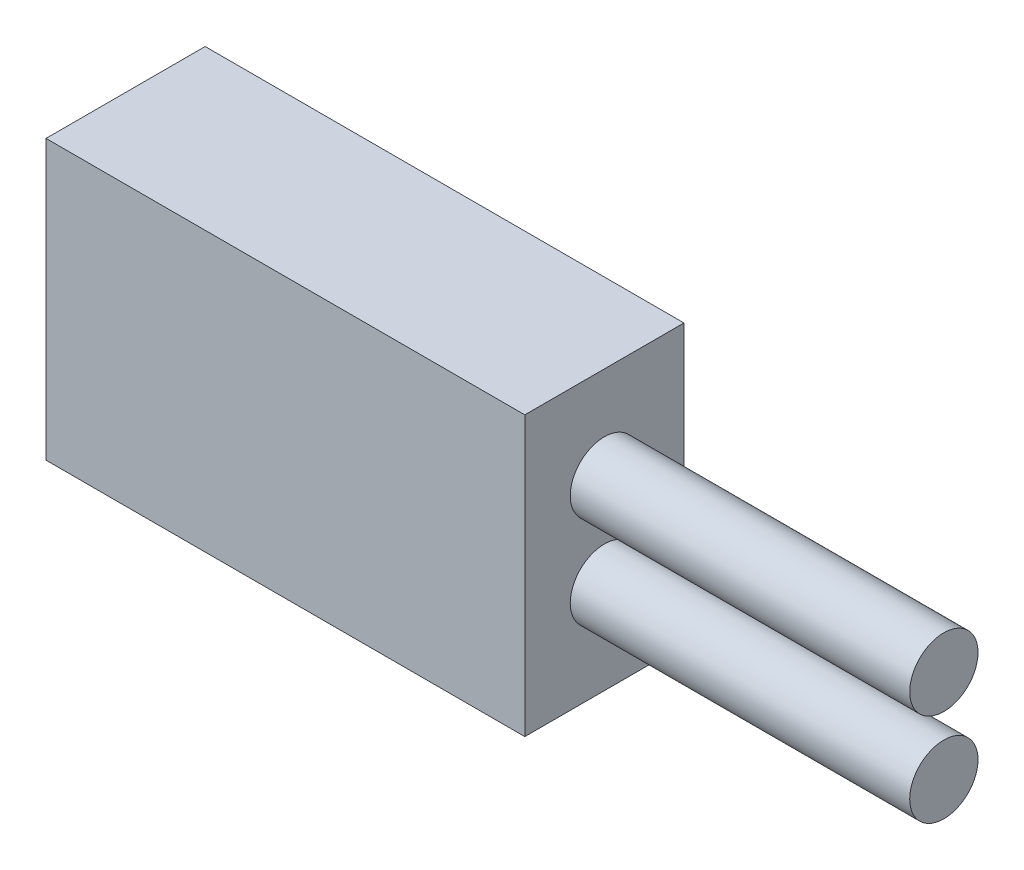
ISO-10303-21;
HEADER;
FILE_DESCRIPTION(('STEP AP214'),'2;1');
FILE_NAME('part.step','',(''),(''),'','','');
FILE_SCHEMA(('AUTOMOTIVE_DESIGN { 1 0 10303 214 1 1 1 1 }'));
ENDSEC;
DATA;
#1=APPLICATION_CONTEXT('core data for automotive mechanical design processes');
#2=APPLICATION_PROTOCOL_DEFINITION('international standard','automotive_design',2000,#1);
#3=PRODUCT_CONTEXT('',#1,'mechanical');
#4=PRODUCT('Part','Part','',(#3));
#5=PRODUCT_RELATED_PRODUCT_CATEGORY('part','',(#4));
#6=PRODUCT_DEFINITION_FORMATION('','',#4);
#7=PRODUCT_DEFINITION_CONTEXT('part definition',#1,'design');
#8=PRODUCT_DEFINITION('design','',#6,#7);
#9=PRODUCT_DEFINITION_SHAPE('','',#8);
#10=(LENGTH_UNIT() NAMED_UNIT(*) SI_UNIT(.MILLI.,.METRE.));
#11=(NAMED_UNIT(*) PLANE_ANGLE_UNIT() SI_UNIT($,.RADIAN.));
#12=(NAMED_UNIT(*) SI_UNIT($,.STERADIAN.) SOLID_ANGLE_UNIT());
#13=UNCERTAINTY_MEASURE_WITH_UNIT(LENGTH_MEASURE(1.E-05),#10,'distance_accuracy_value','');
#14=(GEOMETRIC_REPRESENTATION_CONTEXT(3) GLOBAL_UNCERTAINTY_ASSIGNED_CONTEXT((#13)) GLOBAL_UNIT_ASSIGNED_CONTEXT((#10,
#11,#12)) REPRESENTATION_CONTEXT('',''));
#15=CARTESIAN_POINT('',(0.,0.,0.));
#16=DIRECTION('',(0.,0.,1.));
#17=DIRECTION('',(1.,0.,0.));
#18=AXIS2_PLACEMENT_3D('',#15,#16,#17);
#19=CARTESIAN_POINT('',(0.,0.,23.3));
#20=DIRECTION('',(1.,0.,0.));
#21=DIRECTION('',(0.,0.,-1.));
#22=AXIS2_PLACEMENT_3D('',#19,#20,#21);
#23=PLANE('',#22);
#24=DIRECTION('',(0.,-1.,0.));
#25=VECTOR('',#24,1.);
#26=CARTESIAN_POINT('',(0.,0.,0.));
#27=LINE('',#26,#25);
#28=CARTESIAN_POINT('',(0.,40.8,0.));
#29=VERTEX_POINT('',#28);
#30=CARTESIAN_POINT('',(0.,0.,0.));
#31=VERTEX_POINT('',#30);
#32=EDGE_CURVE('E111',#29,#31,#27,.T.);
#33=ORIENTED_EDGE('',*,*,#32,.T.);
#34=DIRECTION('',(0.,0.,-1.));
#35=VECTOR('',#34,1.);
#36=CARTESIAN_POINT('',(0.,0.,23.3));
#37=LINE('',#36,#35);
#38=CARTESIAN_POINT('',(0.,0.,23.3));
#39=VERTEX_POINT('',#38);
#40=EDGE_CURVE('E100',#39,#31,#37,.T.);
#41=ORIENTED_EDGE('',*,*,#40,.F.);
#42=DIRECTION('',(0.,-1.,0.));
#43=VECTOR('',#42,1.);
#44=CARTESIAN_POINT('',(0.,0.,23.3));
#45=LINE('',#44,#43);
#46=CARTESIAN_POINT('',(0.,40.8,23.3));
#47=VERTEX_POINT('',#46);
#48=EDGE_CURVE('E92',#47,#39,#45,.T.);
#49=ORIENTED_EDGE('',*,*,#48,.F.);
#50=DIRECTION('',(0.,0.,-1.));
#51=VECTOR('',#50,1.);
#52=CARTESIAN_POINT('',(0.,40.8,23.3));
#53=LINE('',#52,#51);
#54=EDGE_CURVE('E107',#47,#29,#53,.T.);
#55=ORIENTED_EDGE('',*,*,#54,.T.);
#56=EDGE_LOOP('',(#33,#41,#49,#55));
#57=FACE_BOUND('',#56,.T.);
#58=ADVANCED_FACE('F39',(#57),#23,.F.);
#59=CARTESIAN_POINT('',(0.,0.,23.3));
#60=DIRECTION('',(0.,1.,0.));
#61=DIRECTION('',(0.,0.,1.));
#62=AXIS2_PLACEMENT_3D('',#59,#60,#61);
#63=PLANE('',#62);
#64=DIRECTION('',(1.,0.,0.));
#65=VECTOR('',#64,1.);
#66=CARTESIAN_POINT('',(0.,0.,0.));
#67=LINE('',#66,#65);
#68=CARTESIAN_POINT('',(70.1,0.,0.));
#69=VERTEX_POINT('',#68);
#70=EDGE_CURVE('E98',#31,#69,#67,.T.);
#71=ORIENTED_EDGE('',*,*,#70,.T.);
#72=DIRECTION('',(0.,0.,-1.));
#73=VECTOR('',#72,1.);
#74=CARTESIAN_POINT('',(70.1,0.,23.3));
#75=LINE('',#74,#73);
#76=CARTESIAN_POINT('',(70.1,0.,23.3));
#77=VERTEX_POINT('',#76);
#78=EDGE_CURVE('E96',#77,#69,#75,.T.);
#79=ORIENTED_EDGE('',*,*,#78,.F.);
#80=DIRECTION('',(1.,0.,0.));
#81=VECTOR('',#80,1.);
#82=CARTESIAN_POINT('',(0.,0.,23.3));
#83=LINE('',#82,#81);
#84=EDGE_CURVE('E87',#39,#77,#83,.T.);
#85=ORIENTED_EDGE('',*,*,#84,.F.);
#86=ORIENTED_EDGE('',*,*,#40,.T.);
#87=EDGE_LOOP('',(#71,#79,#85,#86));
#88=FACE_BOUND('',#87,.T.);
#89=ADVANCED_FACE('F97',(#88),#63,.F.);
#90=CARTESIAN_POINT('',(70.1,0.,23.3));
#91=DIRECTION('',(-1.,0.,0.));
#92=DIRECTION('',(0.,0.,1.));
#93=AXIS2_PLACEMENT_3D('',#90,#91,#92);
#94=PLANE('',#93);
#95=CARTESIAN_POINT('',(70.1,13.6,11.65));
#96=DIRECTION('',(-1.,0.,0.));
#97=DIRECTION('',(0.,0.,1.));
#98=AXIS2_PLACEMENT_3D('',#95,#96,#97);
#99=CIRCLE('',#98,5.);
#100=CARTESIAN_POINT('',(70.1,13.6,16.65));
#101=VERTEX_POINT('',#100);
#102=EDGE_CURVE('E11',#101,#101,#99,.F.);
#103=ORIENTED_EDGE('',*,*,#102,.F.);
#104=EDGE_LOOP('',(#103));
#105=FACE_BOUND('',#104,.T.);
#106=CARTESIAN_POINT('',(70.1,27.2,11.65));
#107=DIRECTION('',(1.,0.,0.));
#108=DIRECTION('',(0.,0.,-1.));
#109=AXIS2_PLACEMENT_3D('',#106,#107,#108);
#110=CIRCLE('',#109,5.);
#111=CARTESIAN_POINT('',(70.1,27.2,6.65));
#112=VERTEX_POINT('',#111);
#113=EDGE_CURVE('E48',#112,#112,#110,.T.);
#114=ORIENTED_EDGE('',*,*,#113,.F.);
#115=EDGE_LOOP('',(#114));
#116=FACE_BOUND('',#115,.T.);
#117=DIRECTION('',(0.,1.,0.));
#118=VECTOR('',#117,1.);
#119=CARTESIAN_POINT('',(70.1,0.,0.));
#120=LINE('',#119,#118);
#121=CARTESIAN_POINT('',(70.1,40.8,0.));
#122=VERTEX_POINT('',#121);
#123=EDGE_CURVE('E73',#69,#122,#120,.T.);
#124=ORIENTED_EDGE('',*,*,#123,.T.);
#125=DIRECTION('',(0.,0.,-1.));
#126=VECTOR('',#125,1.);
#127=CARTESIAN_POINT('',(70.1,40.8,23.3));
#128=LINE('',#127,#126);
#129=CARTESIAN_POINT('',(70.1,40.8,23.3));
#130=VERTEX_POINT('',#129);
#131=EDGE_CURVE('E101',#130,#122,#128,.T.);
#132=ORIENTED_EDGE('',*,*,#131,.F.);
#133=DIRECTION('',(0.,1.,0.));
#134=VECTOR('',#133,1.);
#135=CARTESIAN_POINT('',(70.1,0.,23.3));
#136=LINE('',#135,#134);
#137=EDGE_CURVE('E90',#77,#130,#136,.T.);
#138=ORIENTED_EDGE('',*,*,#137,.F.);
#139=ORIENTED_EDGE('',*,*,#78,.T.);
#140=EDGE_LOOP('',(#124,#132,#138,#139));
#141=FACE_BOUND('',#140,.T.);
#142=ADVANCED_FACE('F103',(#105,#116,#141),#94,.F.);
#143=CARTESIAN_POINT('',(0.,40.8,23.3));
#144=DIRECTION('',(0.,-1.,0.));
#145=DIRECTION('',(0.,0.,-1.));
#146=AXIS2_PLACEMENT_3D('',#143,#144,#145);
#147=PLANE('',#146);
#148=DIRECTION('',(-1.,0.,0.));
#149=VECTOR('',#148,1.);
#150=CARTESIAN_POINT('',(0.,40.8,0.));
#151=LINE('',#150,#149);
#152=EDGE_CURVE('E79',#122,#29,#151,.T.);
#153=ORIENTED_EDGE('',*,*,#152,.T.);
#154=ORIENTED_EDGE('',*,*,#54,.F.);
#155=DIRECTION('',(-1.,0.,0.));
#156=VECTOR('',#155,1.);
#157=CARTESIAN_POINT('',(0.,40.8,23.3));
#158=LINE('',#157,#156);
#159=EDGE_CURVE('E56',#130,#47,#158,.T.);
#160=ORIENTED_EDGE('',*,*,#159,.F.);
#161=ORIENTED_EDGE('',*,*,#131,.T.);
#162=EDGE_LOOP('',(#153,#154,#160,#161));
#163=FACE_BOUND('',#162,.T.);
#164=ADVANCED_FACE('F152',(#163),#147,.F.);
#165=CARTESIAN_POINT('',(0.,0.,23.3));
#166=DIRECTION('',(0.,0.,-1.));
#167=DIRECTION('',(-1.,0.,0.));
#168=AXIS2_PLACEMENT_3D('',#165,#166,#167);
#169=PLANE('',#168);
#170=ORIENTED_EDGE('',*,*,#48,.T.);
#171=ORIENTED_EDGE('',*,*,#84,.T.);
#172=ORIENTED_EDGE('',*,*,#137,.T.);
#173=ORIENTED_EDGE('',*,*,#159,.T.);
#174=EDGE_LOOP('',(#170,#171,#172,#173));
#175=FACE_BOUND('',#174,.T.);
#176=ADVANCED_FACE('F88',(#175),#169,.F.);
#177=CARTESIAN_POINT('',(0.,0.,0.));
#178=DIRECTION('',(0.,0.,-1.));
#179=DIRECTION('',(-1.,0.,0.));
#180=AXIS2_PLACEMENT_3D('',#177,#178,#179);
#181=PLANE('',#180);
#182=ORIENTED_EDGE('',*,*,#32,.F.);
#183=ORIENTED_EDGE('',*,*,#152,.F.);
#184=ORIENTED_EDGE('',*,*,#123,.F.);
#185=ORIENTED_EDGE('',*,*,#70,.F.);
#186=EDGE_LOOP('',(#182,#183,#184,#185));
#187=FACE_BOUND('',#186,.T.);
#188=ADVANCED_FACE('F165',(#187),#181,.T.);
#189=CARTESIAN_POINT('',(119.8,27.2,11.65));
#190=DIRECTION('',(-1.,0.,0.));
#191=DIRECTION('',(0.,0.,1.));
#192=AXIS2_PLACEMENT_3D('',#189,#190,#191);
#193=CYLINDRICAL_SURFACE('',#192,5.);
#194=CARTESIAN_POINT('',(119.8,27.2,11.65));
#195=DIRECTION('',(1.,0.,0.));
#196=DIRECTION('',(0.,0.,-1.));
#197=AXIS2_PLACEMENT_3D('',#194,#195,#196);
#198=CIRCLE('',#197,5.);
#199=CARTESIAN_POINT('',(119.8,27.2,6.65));
#200=VERTEX_POINT('',#199);
#201=EDGE_CURVE('E115',#200,#200,#198,.T.);
#202=ORIENTED_EDGE('',*,*,#201,.F.);
#203=EDGE_LOOP('',(#202));
#204=FACE_BOUND('',#203,.T.);
#205=ORIENTED_EDGE('',*,*,#113,.T.);
#206=EDGE_LOOP('',(#205));
#207=FACE_BOUND('',#206,.T.);
#208=ADVANCED_FACE('F167',(#204,#207),#193,.T.);
#209=CARTESIAN_POINT('',(119.8,27.2,11.65));
#210=DIRECTION('',(1.,0.,0.));
#211=DIRECTION('',(0.,0.,-1.));
#212=AXIS2_PLACEMENT_3D('',#209,#210,#211);
#213=PLANE('',#212);
#214=ORIENTED_EDGE('',*,*,#201,.T.);
#215=EDGE_LOOP('',(#214));
#216=FACE_BOUND('',#215,.T.);
#217=ADVANCED_FACE('F146',(#216),#213,.T.);
#218=CARTESIAN_POINT('',(119.8,13.6,11.65));
#219=DIRECTION('',(-1.,0.,0.));
#220=DIRECTION('',(0.,0.,1.));
#221=AXIS2_PLACEMENT_3D('',#218,#219,#220);
#222=CYLINDRICAL_SURFACE('',#221,5.);
#223=CARTESIAN_POINT('',(119.8,13.6,11.65));
#224=DIRECTION('',(1.,0.,0.));
#225=DIRECTION('',(0.,0.,-1.));
#226=AXIS2_PLACEMENT_3D('',#223,#224,#225);
#227=CIRCLE('',#226,5.);
#228=CARTESIAN_POINT('',(119.8,13.6,6.65));
#229=VERTEX_POINT('',#228);
#230=EDGE_CURVE('E137',#229,#229,#227,.T.);
#231=ORIENTED_EDGE('',*,*,#230,.F.);
#232=EDGE_LOOP('',(#231));
#233=FACE_BOUND('',#232,.T.);
#234=ORIENTED_EDGE('',*,*,#102,.T.);
#235=EDGE_LOOP('',(#234));
#236=FACE_BOUND('',#235,.T.);
#237=ADVANCED_FACE('F143',(#233,#236),#222,.T.);
#238=CARTESIAN_POINT('',(119.8,13.6,11.65));
#239=DIRECTION('',(1.,0.,0.));
#240=DIRECTION('',(0.,0.,-1.));
#241=AXIS2_PLACEMENT_3D('',#238,#239,#240);
#242=PLANE('',#241);
#243=ORIENTED_EDGE('',*,*,#230,.T.);
#244=EDGE_LOOP('',(#243));
#245=FACE_BOUND('',#244,.T.);
#246=ADVANCED_FACE('F141',(#245),#242,.T.);
#247=CLOSED_SHELL('',(#58,#89,#142,#164,#176,#188,#208,#217,#237,#246));
#248=MANIFOLD_SOLID_BREP('B2',#247);
#249=ADVANCED_BREP_SHAPE_REPRESENTATION('',(#18,#248),#14);
#250=SHAPE_DEFINITION_REPRESENTATION(#9,#249);
ENDSEC;
END-ISO-10303-21;
